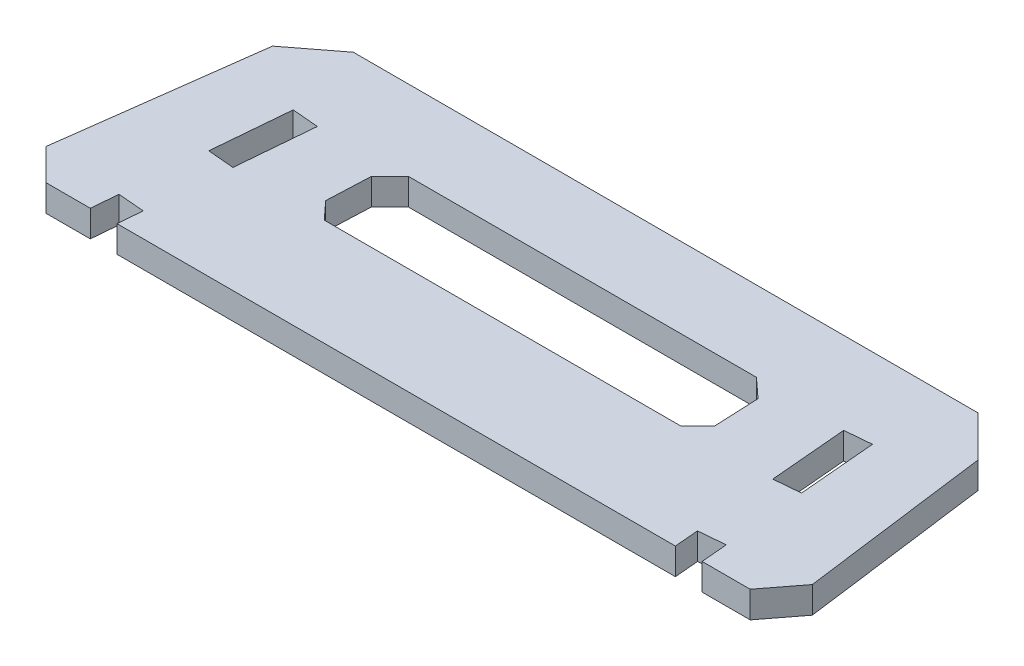
ISO-10303-21;
HEADER;
FILE_DESCRIPTION(('STEP AP214'),'2;1');
FILE_NAME('part.step','',(''),(''),'','','');
FILE_SCHEMA(('AUTOMOTIVE_DESIGN { 1 0 10303 214 1 1 1 1 }'));
ENDSEC;
DATA;
#1=APPLICATION_CONTEXT('core data for automotive mechanical design processes');
#2=APPLICATION_PROTOCOL_DEFINITION('international standard','automotive_design',2000,#1);
#3=PRODUCT_CONTEXT('',#1,'mechanical');
#4=PRODUCT('Part','Part','',(#3));
#5=PRODUCT_RELATED_PRODUCT_CATEGORY('part','',(#4));
#6=PRODUCT_DEFINITION_FORMATION('','',#4);
#7=PRODUCT_DEFINITION_CONTEXT('part definition',#1,'design');
#8=PRODUCT_DEFINITION('design','',#6,#7);
#9=PRODUCT_DEFINITION_SHAPE('','',#8);
#10=(LENGTH_UNIT() NAMED_UNIT(*) SI_UNIT(.MILLI.,.METRE.));
#11=(NAMED_UNIT(*) PLANE_ANGLE_UNIT() SI_UNIT($,.RADIAN.));
#12=(NAMED_UNIT(*) SI_UNIT($,.STERADIAN.) SOLID_ANGLE_UNIT());
#13=UNCERTAINTY_MEASURE_WITH_UNIT(LENGTH_MEASURE(1.E-05),#10,'distance_accuracy_value','');
#14=(GEOMETRIC_REPRESENTATION_CONTEXT(3) GLOBAL_UNCERTAINTY_ASSIGNED_CONTEXT((#13)) GLOBAL_UNIT_ASSIGNED_CONTEXT((#10,
#11,#12)) REPRESENTATION_CONTEXT('',''));
#15=CARTESIAN_POINT('',(0.,0.,0.));
#16=DIRECTION('',(0.,0.,1.));
#17=DIRECTION('',(1.,0.,0.));
#18=AXIS2_PLACEMENT_3D('',#15,#16,#17);
#19=CARTESIAN_POINT('',(-197.980321350722,-15.,2.22044604925031E-13));
#20=DIRECTION('',(0.,0.,-0.999999999999999));
#21=DIRECTION('',(-1.,0.,0.));
#22=AXIS2_PLACEMENT_3D('',#19,#20,#21);
#23=PLANE('',#22);
#24=DIRECTION('',(-1.,0.,0.));
#25=VECTOR('',#24,1.);
#26=CARTESIAN_POINT('',(-197.980321350722,-15.,2.22044604925031E-13));
#27=LINE('',#26,#25);
#28=CARTESIAN_POINT('',(177.980321350722,-15.,2.22044604925031E-13));
#29=VERTEX_POINT('',#28);
#30=CARTESIAN_POINT('',(-174.759320617822,-15.,2.22044604925031E-13));
#31=VERTEX_POINT('',#30);
#32=EDGE_CURVE('E343',#29,#31,#27,.T.);
#33=ORIENTED_EDGE('',*,*,#32,.T.);
#34=DIRECTION('',(0.,0.999999999999999,0.));
#35=VECTOR('',#34,1.);
#36=CARTESIAN_POINT('',(-174.759320617822,-15.,2.22044604925031E-13));
#37=LINE('',#36,#35);
#38=CARTESIAN_POINT('',(-174.759320617822,0.,0.));
#39=VERTEX_POINT('',#38);
#40=EDGE_CURVE('E11',#31,#39,#37,.T.);
#41=ORIENTED_EDGE('',*,*,#40,.T.);
#42=DIRECTION('',(-1.,0.,0.));
#43=VECTOR('',#42,1.);
#44=CARTESIAN_POINT('',(-197.980321350722,0.,0.));
#45=LINE('',#44,#43);
#46=CARTESIAN_POINT('',(177.980321350722,0.,0.));
#47=VERTEX_POINT('',#46);
#48=EDGE_CURVE('E332',#47,#39,#45,.T.);
#49=ORIENTED_EDGE('',*,*,#48,.F.);
#50=DIRECTION('',(0.,-0.999999999999999,0.));
#51=VECTOR('',#50,1.);
#52=CARTESIAN_POINT('',(177.980321350722,-15.,2.22044604925031E-13));
#53=LINE('',#52,#51);
#54=EDGE_CURVE('E40',#47,#29,#53,.T.);
#55=ORIENTED_EDGE('',*,*,#54,.T.);
#56=EDGE_LOOP('',(#33,#41,#49,#55));
#57=FACE_BOUND('',#56,.T.);
#58=ADVANCED_FACE('F32',(#57),#23,.T.);
#59=CARTESIAN_POINT('',(197.980321350722,-15.,2.22044604925031E-13));
#60=DIRECTION('',(0.991487933295307,0.,-0.130198610322082));
#61=DIRECTION('',(-0.130198610322082,0.,-0.991487933295306));
#62=AXIS2_PLACEMENT_3D('',#59,#60,#61);
#63=PLANE('',#62);
#64=DIRECTION('',(-0.130198610322082,0.,-0.991487933295306));
#65=VECTOR('',#64,1.);
#66=CARTESIAN_POINT('',(197.980321350722,0.,0.));
#67=LINE('',#66,#65);
#68=CARTESIAN_POINT('',(215.149047853911,0.,130.743216965596));
#69=VERTEX_POINT('',#68);
#70=CARTESIAN_POINT('',(201.003663376434,0.,23.0233420257117));
#71=VERTEX_POINT('',#70);
#72=EDGE_CURVE('E347',#69,#71,#67,.T.);
#73=ORIENTED_EDGE('',*,*,#72,.F.);
#74=DIRECTION('',(0.,-0.999999999999999,0.));
#75=VECTOR('',#74,1.);
#76=CARTESIAN_POINT('',(215.149047853911,-15.,130.743216965596));
#77=LINE('',#76,#75);
#78=CARTESIAN_POINT('',(215.149047853911,-15.,130.743216965596));
#79=VERTEX_POINT('',#78);
#80=EDGE_CURVE('E478',#69,#79,#77,.T.);
#81=ORIENTED_EDGE('',*,*,#80,.T.);
#82=DIRECTION('',(-0.130198610322082,0.,-0.991487933295306));
#83=VECTOR('',#82,1.);
#84=CARTESIAN_POINT('',(197.980321350722,-15.,2.22044604925031E-13));
#85=LINE('',#84,#83);
#86=CARTESIAN_POINT('',(201.003663376434,-15.,23.0233420257117));
#87=VERTEX_POINT('',#86);
#88=EDGE_CURVE('E375',#79,#87,#85,.T.);
#89=ORIENTED_EDGE('',*,*,#88,.T.);
#90=DIRECTION('',(0.,0.999999999999999,0.));
#91=VECTOR('',#90,1.);
#92=CARTESIAN_POINT('',(201.003663376434,-15.,23.0233420257117));
#93=LINE('',#92,#91);
#94=EDGE_CURVE('E475',#87,#71,#93,.T.);
#95=ORIENTED_EDGE('',*,*,#94,.T.);
#96=EDGE_LOOP('',(#73,#81,#89,#95));
#97=FACE_BOUND('',#96,.T.);
#98=ADVANCED_FACE('F504',(#97),#63,.T.);
#99=CARTESIAN_POINT('',(217.753020060352,-15.,150.572975631502));
#100=DIRECTION('',(0.,0.,0.999999999999999));
#101=DIRECTION('',(1.,0.,0.));
#102=AXIS2_PLACEMENT_3D('',#99,#100,#101);
#103=PLANE('',#102);
#104=DIRECTION('',(1.,0.,0.));
#105=VECTOR('',#104,1.);
#106=CARTESIAN_POINT('',(217.753020060352,-15.,150.572975631502));
#107=LINE('',#106,#105);
#108=CARTESIAN_POINT('',(172.735338859236,-15.,150.572975631502));
#109=VERTEX_POINT('',#108);
#110=CARTESIAN_POINT('',(199.92272681684,-15.,150.572975631502));
#111=VERTEX_POINT('',#110);
#112=EDGE_CURVE('E372',#109,#111,#107,.T.);
#113=ORIENTED_EDGE('',*,*,#112,.T.);
#114=DIRECTION('',(0.,0.999999999999999,0.));
#115=VECTOR('',#114,1.);
#116=CARTESIAN_POINT('',(199.92272681684,-15.,150.572975631502));
#117=LINE('',#116,#115);
#118=CARTESIAN_POINT('',(199.92272681684,0.,150.572975631502));
#119=VERTEX_POINT('',#118);
#120=EDGE_CURVE('E464',#111,#119,#117,.T.);
#121=ORIENTED_EDGE('',*,*,#120,.T.);
#122=DIRECTION('',(1.,0.,0.));
#123=VECTOR('',#122,1.);
#124=CARTESIAN_POINT('',(217.753020060352,0.,150.572975631502));
#125=LINE('',#124,#123);
#126=CARTESIAN_POINT('',(172.735338859236,0.,150.572975631502));
#127=VERTEX_POINT('',#126);
#128=EDGE_CURVE('E407',#127,#119,#125,.T.);
#129=ORIENTED_EDGE('',*,*,#128,.F.);
#130=DIRECTION('',(0.,0.999999999999999,0.));
#131=VECTOR('',#130,1.);
#132=CARTESIAN_POINT('',(172.735338859236,-15.,150.572975631502));
#133=LINE('',#132,#131);
#134=EDGE_CURVE('E412',#109,#127,#133,.T.);
#135=ORIENTED_EDGE('',*,*,#134,.F.);
#136=EDGE_LOOP('',(#113,#121,#129,#135));
#137=FACE_BOUND('',#136,.T.);
#138=ADVANCED_FACE('F514',(#137),#103,.T.);
#139=CARTESIAN_POINT('',(172.735338859236,-15.,150.572975631502));
#140=DIRECTION('',(-0.996223440096612,0.,0.0868265938642716));
#141=DIRECTION('',(0.0868265938642717,0.,0.996223440096611));
#142=AXIS2_PLACEMENT_3D('',#139,#140,#141);
#143=PLANE('',#142);
#144=DIRECTION('',(0.0868265938642717,0.,0.996223440096611));
#145=VECTOR('',#144,1.);
#146=CARTESIAN_POINT('',(172.735338859236,0.,150.572975631502));
#147=LINE('',#146,#145);
#148=CARTESIAN_POINT('',(171.432941588778,0.,135.629642818325));
#149=VERTEX_POINT('',#148);
#150=EDGE_CURVE('E404',#149,#127,#147,.T.);
#151=ORIENTED_EDGE('',*,*,#150,.F.);
#152=DIRECTION('',(0.,0.999999999999999,0.));
#153=VECTOR('',#152,1.);
#154=CARTESIAN_POINT('',(171.432941588778,-15.,135.629642818325));
#155=LINE('',#154,#153);
#156=CARTESIAN_POINT('',(171.432941588778,-15.,135.629642818325));
#157=VERTEX_POINT('',#156);
#158=EDGE_CURVE('E415',#157,#149,#155,.T.);
#159=ORIENTED_EDGE('',*,*,#158,.F.);
#160=DIRECTION('',(0.0868265938642717,0.,0.996223440096611));
#161=VECTOR('',#160,1.);
#162=CARTESIAN_POINT('',(172.735338859236,-15.,150.572975631502));
#163=LINE('',#162,#161);
#164=EDGE_CURVE('E369',#157,#109,#163,.T.);
#165=ORIENTED_EDGE('',*,*,#164,.T.);
#166=ORIENTED_EDGE('',*,*,#134,.T.);
#167=EDGE_LOOP('',(#151,#159,#165,#166));
#168=FACE_BOUND('',#167,.T.);
#169=ADVANCED_FACE('F520',(#168),#143,.T.);
#170=CARTESIAN_POINT('',(171.432941588778,-15.,135.629642818325));
#171=DIRECTION('',(0.0868265938642408,0.,0.996223440096614));
#172=DIRECTION('',(0.996223440096615,0.,-0.0868265938642407));
#173=AXIS2_PLACEMENT_3D('',#170,#171,#172);
#174=PLANE('',#173);
#175=DIRECTION('',(0.996223440096615,0.,-0.0868265938642407));
#176=VECTOR('',#175,1.);
#177=CARTESIAN_POINT('',(171.432941588778,0.,135.629642818325));
#178=LINE('',#177,#176);
#179=CARTESIAN_POINT('',(156.489589987329,0.,136.932041726289));
#180=VERTEX_POINT('',#179);
#181=EDGE_CURVE('E401',#180,#149,#178,.T.);
#182=ORIENTED_EDGE('',*,*,#181,.F.);
#183=DIRECTION('',(0.,0.999999999999999,0.));
#184=VECTOR('',#183,1.);
#185=CARTESIAN_POINT('',(156.489589987329,-15.,136.932041726289));
#186=LINE('',#185,#184);
#187=CARTESIAN_POINT('',(156.489589987329,-15.,136.932041726289));
#188=VERTEX_POINT('',#187);
#189=EDGE_CURVE('E417',#188,#180,#186,.T.);
#190=ORIENTED_EDGE('',*,*,#189,.F.);
#191=DIRECTION('',(0.996223440096615,0.,-0.0868265938642407));
#192=VECTOR('',#191,1.);
#193=CARTESIAN_POINT('',(171.432941588778,-15.,135.629642818325));
#194=LINE('',#193,#192);
#195=EDGE_CURVE('E366',#188,#157,#194,.T.);
#196=ORIENTED_EDGE('',*,*,#195,.T.);
#197=ORIENTED_EDGE('',*,*,#158,.T.);
#198=EDGE_LOOP('',(#182,#190,#196,#197));
#199=FACE_BOUND('',#198,.T.);
#200=ADVANCED_FACE('F523',(#199),#174,.T.);
#201=CARTESIAN_POINT('',(156.489589987329,-15.,136.932041726289));
#202=DIRECTION('',(0.996223440096615,0.,-0.0868265938642424));
#203=DIRECTION('',(-0.0868265938642425,0.,-0.996223440096614));
#204=AXIS2_PLACEMENT_3D('',#201,#202,#203);
#205=PLANE('',#204);
#206=DIRECTION('',(-0.0868265938642425,0.,-0.996223440096614));
#207=VECTOR('',#206,1.);
#208=CARTESIAN_POINT('',(156.489589987329,0.,136.932041726289));
#209=LINE('',#208,#207);
#210=CARTESIAN_POINT('',(157.678475713609,0.,150.572975631502));
#211=VERTEX_POINT('',#210);
#212=EDGE_CURVE('E398',#211,#180,#209,.T.);
#213=ORIENTED_EDGE('',*,*,#212,.F.);
#214=DIRECTION('',(0.,0.999999999999999,0.));
#215=VECTOR('',#214,1.);
#216=CARTESIAN_POINT('',(157.678475713609,-15.,150.572975631502));
#217=LINE('',#216,#215);
#218=CARTESIAN_POINT('',(157.678475713609,-15.,150.572975631502));
#219=VERTEX_POINT('',#218);
#220=EDGE_CURVE('E419',#219,#211,#217,.T.);
#221=ORIENTED_EDGE('',*,*,#220,.F.);
#222=DIRECTION('',(-0.0868265938642425,0.,-0.996223440096614));
#223=VECTOR('',#222,1.);
#224=CARTESIAN_POINT('',(156.489589987329,-15.,136.932041726289));
#225=LINE('',#224,#223);
#226=EDGE_CURVE('E363',#219,#188,#225,.T.);
#227=ORIENTED_EDGE('',*,*,#226,.T.);
#228=ORIENTED_EDGE('',*,*,#189,.T.);
#229=EDGE_LOOP('',(#213,#221,#227,#228));
#230=FACE_BOUND('',#229,.T.);
#231=ADVANCED_FACE('F528',(#230),#205,.T.);
#232=CARTESIAN_POINT('',(157.678475713609,-15.,150.572975631502));
#233=DIRECTION('',(0.,0.,0.999999999999999));
#234=DIRECTION('',(1.,0.,0.));
#235=AXIS2_PLACEMENT_3D('',#232,#233,#234);
#236=PLANE('',#235);
#237=DIRECTION('',(1.,0.,0.));
#238=VECTOR('',#237,1.);
#239=CARTESIAN_POINT('',(157.678475713609,0.,150.572975631502));
#240=LINE('',#239,#238);
#241=CARTESIAN_POINT('',(-157.67847571361,0.,150.572975631502));
#242=VERTEX_POINT('',#241);
#243=EDGE_CURVE('E395',#242,#211,#240,.T.);
#244=ORIENTED_EDGE('',*,*,#243,.F.);
#245=DIRECTION('',(0.,0.999999999999999,0.));
#246=VECTOR('',#245,1.);
#247=CARTESIAN_POINT('',(-157.67847571361,-15.,150.572975631502));
#248=LINE('',#247,#246);
#249=CARTESIAN_POINT('',(-157.67847571361,-15.,150.572975631502));
#250=VERTEX_POINT('',#249);
#251=EDGE_CURVE('E421',#250,#242,#248,.T.);
#252=ORIENTED_EDGE('',*,*,#251,.F.);
#253=DIRECTION('',(1.,0.,0.));
#254=VECTOR('',#253,1.);
#255=CARTESIAN_POINT('',(157.678475713609,-15.,150.572975631502));
#256=LINE('',#255,#254);
#257=EDGE_CURVE('E360',#250,#219,#256,.T.);
#258=ORIENTED_EDGE('',*,*,#257,.T.);
#259=ORIENTED_EDGE('',*,*,#220,.T.);
#260=EDGE_LOOP('',(#244,#252,#258,#259));
#261=FACE_BOUND('',#260,.T.);
#262=ADVANCED_FACE('F531',(#261),#236,.T.);
#263=CARTESIAN_POINT('',(-156.489589987329,-15.,136.932041726289));
#264=DIRECTION('',(-0.996223440096611,0.,-0.0868265938642858));
#265=DIRECTION('',(-0.0868265938642859,0.,0.99622344009661));
#266=AXIS2_PLACEMENT_3D('',#263,#264,#265);
#267=PLANE('',#266);
#268=DIRECTION('',(-0.0868265938642859,0.,0.99622344009661));
#269=VECTOR('',#268,1.);
#270=CARTESIAN_POINT('',(-156.489589987329,0.,136.932041726289));
#271=LINE('',#270,#269);
#272=CARTESIAN_POINT('',(-156.489589987329,0.,136.932041726289));
#273=VERTEX_POINT('',#272);
#274=EDGE_CURVE('E392',#273,#242,#271,.T.);
#275=ORIENTED_EDGE('',*,*,#274,.F.);
#276=DIRECTION('',(0.,0.999999999999999,0.));
#277=VECTOR('',#276,1.);
#278=CARTESIAN_POINT('',(-156.489589987329,-15.,136.932041726289));
#279=LINE('',#278,#277);
#280=CARTESIAN_POINT('',(-156.489589987329,-15.,136.932041726289));
#281=VERTEX_POINT('',#280);
#282=EDGE_CURVE('E423',#281,#273,#279,.T.);
#283=ORIENTED_EDGE('',*,*,#282,.F.);
#284=DIRECTION('',(-0.0868265938642859,0.,0.99622344009661));
#285=VECTOR('',#284,1.);
#286=CARTESIAN_POINT('',(-156.489589987329,-15.,136.932041726289));
#287=LINE('',#286,#285);
#288=EDGE_CURVE('E357',#281,#250,#287,.T.);
#289=ORIENTED_EDGE('',*,*,#288,.T.);
#290=ORIENTED_EDGE('',*,*,#251,.T.);
#291=EDGE_LOOP('',(#275,#283,#289,#290));
#292=FACE_BOUND('',#291,.T.);
#293=ADVANCED_FACE('F536',(#292),#267,.T.);
#294=CARTESIAN_POINT('',(-171.432941588778,-15.,135.629642818325));
#295=DIRECTION('',(-0.0868265938642331,0.,0.996223440096614));
#296=DIRECTION('',(0.996223440096616,0.,0.086826593864233));
#297=AXIS2_PLACEMENT_3D('',#294,#295,#296);
#298=PLANE('',#297);
#299=DIRECTION('',(0.996223440096616,0.,0.086826593864233));
#300=VECTOR('',#299,1.);
#301=CARTESIAN_POINT('',(-171.432941588778,0.,135.629642818325));
#302=LINE('',#301,#300);
#303=CARTESIAN_POINT('',(-171.432941588778,0.,135.629642818325));
#304=VERTEX_POINT('',#303);
#305=EDGE_CURVE('E389',#304,#273,#302,.T.);
#306=ORIENTED_EDGE('',*,*,#305,.F.);
#307=DIRECTION('',(0.,0.999999999999999,0.));
#308=VECTOR('',#307,1.);
#309=CARTESIAN_POINT('',(-171.432941588778,-15.,135.629642818325));
#310=LINE('',#309,#308);
#311=CARTESIAN_POINT('',(-171.432941588778,-15.,135.629642818325));
#312=VERTEX_POINT('',#311);
#313=EDGE_CURVE('E425',#312,#304,#310,.T.);
#314=ORIENTED_EDGE('',*,*,#313,.F.);
#315=DIRECTION('',(0.996223440096616,0.,0.086826593864233));
#316=VECTOR('',#315,1.);
#317=CARTESIAN_POINT('',(-171.432941588778,-15.,135.629642818325));
#318=LINE('',#317,#316);
#319=EDGE_CURVE('E354',#312,#281,#318,.T.);
#320=ORIENTED_EDGE('',*,*,#319,.T.);
#321=ORIENTED_EDGE('',*,*,#282,.T.);
#322=EDGE_LOOP('',(#306,#314,#320,#321));
#323=FACE_BOUND('',#322,.T.);
#324=ADVANCED_FACE('F539',(#323),#298,.T.);
#325=CARTESIAN_POINT('',(-172.735338859236,-15.,150.572975631502));
#326=DIRECTION('',(0.996223440096615,0.,0.0868265938642385));
#327=DIRECTION('',(0.0868265938642386,0.,-0.996223440096614));
#328=AXIS2_PLACEMENT_3D('',#325,#326,#327);
#329=PLANE('',#328);
#330=DIRECTION('',(0.0868265938642386,0.,-0.996223440096614));
#331=VECTOR('',#330,1.);
#332=CARTESIAN_POINT('',(-172.735338859236,0.,150.572975631502));
#333=LINE('',#332,#331);
#334=CARTESIAN_POINT('',(-172.735338859236,0.,150.572975631502));
#335=VERTEX_POINT('',#334);
#336=EDGE_CURVE('E386',#335,#304,#333,.T.);
#337=ORIENTED_EDGE('',*,*,#336,.F.);
#338=DIRECTION('',(0.,0.999999999999999,0.));
#339=VECTOR('',#338,1.);
#340=CARTESIAN_POINT('',(-172.735338859236,-15.,150.572975631502));
#341=LINE('',#340,#339);
#342=CARTESIAN_POINT('',(-172.735338859236,-15.,150.572975631502));
#343=VERTEX_POINT('',#342);
#344=EDGE_CURVE('E378',#343,#335,#341,.T.);
#345=ORIENTED_EDGE('',*,*,#344,.F.);
#346=DIRECTION('',(0.0868265938642386,0.,-0.996223440096614));
#347=VECTOR('',#346,1.);
#348=CARTESIAN_POINT('',(-172.735338859236,-15.,150.572975631502));
#349=LINE('',#348,#347);
#350=EDGE_CURVE('E351',#343,#312,#349,.T.);
#351=ORIENTED_EDGE('',*,*,#350,.T.);
#352=ORIENTED_EDGE('',*,*,#313,.T.);
#353=EDGE_LOOP('',(#337,#345,#351,#352));
#354=FACE_BOUND('',#353,.T.);
#355=ADVANCED_FACE('F544',(#354),#329,.T.);
#356=CARTESIAN_POINT('',(-217.753020060352,-15.,150.572975631502));
#357=DIRECTION('',(0.,0.,0.999999999999999));
#358=DIRECTION('',(1.,0.,0.));
#359=AXIS2_PLACEMENT_3D('',#356,#357,#358);
#360=PLANE('',#359);
#361=DIRECTION('',(1.,0.,0.));
#362=VECTOR('',#361,1.);
#363=CARTESIAN_POINT('',(-217.753020060352,0.,150.572975631502));
#364=LINE('',#363,#362);
#365=CARTESIAN_POINT('',(-197.753020060352,0.,150.572975631502));
#366=VERTEX_POINT('',#365);
#367=EDGE_CURVE('E384',#366,#335,#364,.T.);
#368=ORIENTED_EDGE('',*,*,#367,.F.);
#369=DIRECTION('',(0.,-0.999999999999999,0.));
#370=VECTOR('',#369,1.);
#371=CARTESIAN_POINT('',(-197.753020060352,-15.,150.572975631502));
#372=LINE('',#371,#370);
#373=CARTESIAN_POINT('',(-197.753020060352,-15.,150.572975631502));
#374=VERTEX_POINT('',#373);
#375=EDGE_CURVE('E491',#366,#374,#372,.T.);
#376=ORIENTED_EDGE('',*,*,#375,.T.);
#377=DIRECTION('',(1.,0.,0.));
#378=VECTOR('',#377,1.);
#379=CARTESIAN_POINT('',(-217.753020060352,-15.,150.572975631502));
#380=LINE('',#379,#378);
#381=EDGE_CURVE('E349',#374,#343,#380,.T.);
#382=ORIENTED_EDGE('',*,*,#381,.T.);
#383=ORIENTED_EDGE('',*,*,#344,.T.);
#384=EDGE_LOOP('',(#368,#376,#382,#383));
#385=FACE_BOUND('',#384,.T.);
#386=ADVANCED_FACE('F547',(#385),#360,.T.);
#387=CARTESIAN_POINT('',(-217.753020060352,-15.,150.572975631502));
#388=DIRECTION('',(-0.991487933295307,0.,-0.130198610322082));
#389=DIRECTION('',(-0.130198610322082,0.,0.991487933295306));
#390=AXIS2_PLACEMENT_3D('',#387,#388,#389);
#391=PLANE('',#390);
#392=DIRECTION('',(-0.130198610322082,0.,0.991487933295306));
#393=VECTOR('',#392,1.);
#394=CARTESIAN_POINT('',(-217.753020060352,-15.,150.572975631502));
#395=LINE('',#394,#393);
#396=CARTESIAN_POINT('',(-200.584293557164,-15.,19.8297586659063));
#397=VERTEX_POINT('',#396);
#398=CARTESIAN_POINT('',(-215.431540658412,-15.,132.894455033442));
#399=VERTEX_POINT('',#398);
#400=EDGE_CURVE('E346',#397,#399,#395,.T.);
#401=ORIENTED_EDGE('',*,*,#400,.T.);
#402=DIRECTION('',(0.,0.999999999999999,0.));
#403=VECTOR('',#402,1.);
#404=CARTESIAN_POINT('',(-215.431540658412,-15.,132.894455033442));
#405=LINE('',#404,#403);
#406=CARTESIAN_POINT('',(-215.431540658412,0.,132.894455033442));
#407=VERTEX_POINT('',#406);
#408=EDGE_CURVE('E488',#399,#407,#405,.T.);
#409=ORIENTED_EDGE('',*,*,#408,.T.);
#410=DIRECTION('',(-0.130198610322082,0.,0.991487933295306));
#411=VECTOR('',#410,1.);
#412=CARTESIAN_POINT('',(-217.753020060352,0.,150.572975631502));
#413=LINE('',#412,#411);
#414=CARTESIAN_POINT('',(-200.584293557164,0.,19.8297586659063));
#415=VERTEX_POINT('',#414);
#416=EDGE_CURVE('E381',#415,#407,#413,.T.);
#417=ORIENTED_EDGE('',*,*,#416,.F.);
#418=DIRECTION('',(0.,-0.999999999999999,0.));
#419=VECTOR('',#418,1.);
#420=CARTESIAN_POINT('',(-200.584293557164,-15.,19.8297586659061));
#421=LINE('',#420,#419);
#422=EDGE_CURVE('E54',#415,#397,#421,.T.);
#423=ORIENTED_EDGE('',*,*,#422,.T.);
#424=EDGE_LOOP('',(#401,#409,#417,#423));
#425=FACE_BOUND('',#424,.T.);
#426=ADVANCED_FACE('F552',(#425),#391,.T.);
#427=CARTESIAN_POINT('',(0.,-15.,2.22044604925031E-13));
#428=DIRECTION('',(0.,0.999999999999999,0.));
#429=DIRECTION('',(0.,0.,0.999999999999999));
#430=AXIS2_PLACEMENT_3D('',#427,#428,#429);
#431=PLANE('',#430);
#432=DIRECTION('',(0.0868265938642406,0.,0.996223440096614));
#433=VECTOR('',#432,1.);
#434=CARTESIAN_POINT('',(152.429155902054,-15.,90.343785378901));
#435=LINE('',#434,#433);
#436=CARTESIAN_POINT('',(148.605677587565,-15.,46.4742915974143));
#437=VERTEX_POINT('',#436);
#438=CARTESIAN_POINT('',(152.429155902054,-15.,90.343785378901));
#439=VERTEX_POINT('',#438);
#440=EDGE_CURVE('E255',#437,#439,#435,.T.);
#441=ORIENTED_EDGE('',*,*,#440,.T.);
#442=DIRECTION('',(0.996223440096615,0.,-0.0868265938642403));
#443=VECTOR('',#442,1.);
#444=CARTESIAN_POINT('',(167.372507503504,-15.,89.0413864709374));
#445=LINE('',#444,#443);
#446=CARTESIAN_POINT('',(167.372507503504,-15.,89.0413864709374));
#447=VERTEX_POINT('',#446);
#448=EDGE_CURVE('E247',#439,#447,#445,.T.);
#449=ORIENTED_EDGE('',*,*,#448,.T.);
#450=DIRECTION('',(-0.0868265938642406,0.,-0.996223440096614));
#451=VECTOR('',#450,1.);
#452=CARTESIAN_POINT('',(163.549029189015,-15.,45.1718926894505));
#453=LINE('',#452,#451);
#454=CARTESIAN_POINT('',(163.549029189015,-15.,45.1718926894505));
#455=VERTEX_POINT('',#454);
#456=EDGE_CURVE('E259',#447,#455,#453,.T.);
#457=ORIENTED_EDGE('',*,*,#456,.T.);
#458=DIRECTION('',(-0.996223440096615,0.,0.0868265938642403));
#459=VECTOR('',#458,1.);
#460=CARTESIAN_POINT('',(148.605677587565,-15.,46.4742915974143));
#461=LINE('',#460,#459);
#462=EDGE_CURVE('E263',#455,#437,#461,.T.);
#463=ORIENTED_EDGE('',*,*,#462,.T.);
#464=EDGE_LOOP('',(#441,#449,#457,#463));
#465=FACE_BOUND('',#464,.T.);
#466=DIRECTION('',(0.0868265938642406,0.,-0.996223440096614));
#467=VECTOR('',#466,1.);
#468=CARTESIAN_POINT('',(-152.429155902054,-15.,90.3437853789011));
#469=LINE('',#468,#467);
#470=CARTESIAN_POINT('',(-152.429155902054,-15.,90.3437853789011));
#471=VERTEX_POINT('',#470);
#472=CARTESIAN_POINT('',(-148.605677587565,-15.,46.4742915974141));
#473=VERTEX_POINT('',#472);
#474=EDGE_CURVE('E297',#471,#473,#469,.T.);
#475=ORIENTED_EDGE('',*,*,#474,.T.);
#476=DIRECTION('',(-0.996223440096615,0.,-0.0868265938642403));
#477=VECTOR('',#476,1.);
#478=CARTESIAN_POINT('',(-148.605677587565,-15.,46.4742915974141));
#479=LINE('',#478,#477);
#480=CARTESIAN_POINT('',(-163.549029189015,-15.,45.1718926894505));
#481=VERTEX_POINT('',#480);
#482=EDGE_CURVE('E287',#473,#481,#479,.T.);
#483=ORIENTED_EDGE('',*,*,#482,.T.);
#484=DIRECTION('',(-0.0868265938642406,0.,0.996223440096614));
#485=VECTOR('',#484,1.);
#486=CARTESIAN_POINT('',(-163.549029189015,-15.,45.1718926894505));
#487=LINE('',#486,#485);
#488=CARTESIAN_POINT('',(-167.372507503504,-15.,89.0413864709375));
#489=VERTEX_POINT('',#488);
#490=EDGE_CURVE('E290',#481,#489,#487,.T.);
#491=ORIENTED_EDGE('',*,*,#490,.T.);
#492=DIRECTION('',(0.996223440096615,0.,0.0868265938642403));
#493=VECTOR('',#492,1.);
#494=CARTESIAN_POINT('',(-167.372507503504,-15.,89.0413864709375));
#495=LINE('',#494,#493);
#496=EDGE_CURVE('E294',#489,#471,#495,.T.);
#497=ORIENTED_EDGE('',*,*,#496,.T.);
#498=EDGE_LOOP('',(#475,#483,#491,#497));
#499=FACE_BOUND('',#498,.T.);
#500=DIRECTION('',(1.,0.,0.));
#501=VECTOR('',#500,1.);
#502=CARTESIAN_POINT('',(110.449460378403,-15.,90.3437853789011));
#503=LINE('',#502,#501);
#504=CARTESIAN_POINT('',(-100.855771125688,-15.,90.3437853789011));
#505=VERTEX_POINT('',#504);
#506=CARTESIAN_POINT('',(100.449460378403,-15.,90.3437853789011));
#507=VERTEX_POINT('',#506);
#508=EDGE_CURVE('E326',#505,#507,#503,.T.);
#509=ORIENTED_EDGE('',*,*,#508,.T.);
#510=DIRECTION('',(-0.707106781186543,0.,0.707106781186551));
#511=VECTOR('',#510,1.);
#512=CARTESIAN_POINT('',(95.3966228786525,-15.,95.3966228786515));
#513=LINE('',#512,#511);
#514=CARTESIAN_POINT('',(110.034156304942,-15.,80.7590894523616));
#515=VERTEX_POINT('',#514);
#516=EDGE_CURVE('E458',#507,#515,#513,.F.);
#517=ORIENTED_EDGE('',*,*,#516,.T.);
#518=DIRECTION('',(-0.0432892980500775,0.,-0.99906257895806));
#519=VECTOR('',#518,1.);
#520=CARTESIAN_POINT('',(108.492166043388,-15.,45.1718926894505));
#521=LINE('',#520,#519);
#522=CARTESIAN_POINT('',(108.925059023889,-15.,55.1625184790314));
#523=VERTEX_POINT('',#522);
#524=EDGE_CURVE('E329',#515,#523,#521,.T.);
#525=ORIENTED_EDGE('',*,*,#524,.T.);
#526=DIRECTION('',(0.737054080614984,0.,0.675833768206946));
#527=VECTOR('',#526,1.);
#528=CARTESIAN_POINT('',(22.2737736752532,-15.,-24.2914405144268));
#529=LINE('',#528,#527);
#530=CARTESIAN_POINT('',(98.029433719986,-15.,45.1718926894505));
#531=VERTEX_POINT('',#530);
#532=EDGE_CURVE('E454',#523,#531,#529,.F.);
#533=ORIENTED_EDGE('',*,*,#532,.T.);
#534=DIRECTION('',(-1.,0.,0.));
#535=VECTOR('',#534,1.);
#536=CARTESIAN_POINT('',(-108.492166043388,-15.,45.1718926894505));
#537=LINE('',#536,#535);
#538=CARTESIAN_POINT('',(-98.4921660433883,-15.,45.1718926894505));
#539=VERTEX_POINT('',#538);
#540=EDGE_CURVE('E319',#531,#539,#537,.T.);
#541=ORIENTED_EDGE('',*,*,#540,.T.);
#542=DIRECTION('',(0.707106781186544,0.,-0.70710678118655));
#543=VECTOR('',#542,1.);
#544=CARTESIAN_POINT('',(-26.6601366769694,-15.,-26.6601366769691));
#545=LINE('',#544,#543);
#546=CARTESIAN_POINT('',(-108.945090381354,-15.,55.6248170274164));
#547=VERTEX_POINT('',#546);
#548=EDGE_CURVE('E450',#539,#547,#545,.F.);
#549=ORIENTED_EDGE('',*,*,#548,.T.);
#550=DIRECTION('',(-0.0432892980500775,0.,0.99906257895806));
#551=VECTOR('',#550,1.);
#552=CARTESIAN_POINT('',(-110.449460378403,-15.,90.3437853789011));
#553=LINE('',#552,#551);
#554=CARTESIAN_POINT('',(-110.016567397902,-15.,80.3531595893205));
#555=VERTEX_POINT('',#554);
#556=EDGE_CURVE('E322',#547,#555,#553,.T.);
#557=ORIENTED_EDGE('',*,*,#556,.T.);
#558=DIRECTION('',(-0.675833768206952,0.,-0.737054080614978));
#559=VECTOR('',#558,1.);
#560=CARTESIAN_POINT('',(-99.7923600907862,-15.,91.5035253615966));
#561=LINE('',#560,#559);
#562=EDGE_CURVE('E462',#555,#505,#561,.F.);
#563=ORIENTED_EDGE('',*,*,#562,.T.);
#564=EDGE_LOOP('',(#509,#517,#525,#533,#541,#549,#557,#563));
#565=FACE_BOUND('',#564,.T.);
#566=ORIENTED_EDGE('',*,*,#88,.F.);
#567=DIRECTION('',(0.609023520837936,0.,-0.793152161357556));
#568=VECTOR('',#567,1.);
#569=CARTESIAN_POINT('',(199.92272681684,-15.,150.572975631502));
#570=LINE('',#569,#568);
#571=EDGE_CURVE('E485',#79,#111,#570,.F.);
#572=ORIENTED_EDGE('',*,*,#571,.T.);
#573=ORIENTED_EDGE('',*,*,#112,.F.);
#574=ORIENTED_EDGE('',*,*,#164,.F.);
#575=ORIENTED_EDGE('',*,*,#195,.F.);
#576=ORIENTED_EDGE('',*,*,#226,.F.);
#577=ORIENTED_EDGE('',*,*,#257,.F.);
#578=ORIENTED_EDGE('',*,*,#288,.F.);
#579=ORIENTED_EDGE('',*,*,#319,.F.);
#580=ORIENTED_EDGE('',*,*,#350,.F.);
#581=ORIENTED_EDGE('',*,*,#381,.F.);
#582=DIRECTION('',(0.707106781186548,0.,0.707106781186546));
#583=VECTOR('',#582,1.);
#584=CARTESIAN_POINT('',(-215.431540658412,-15.,132.894455033442));
#585=LINE('',#584,#583);
#586=EDGE_CURVE('E47',#374,#399,#585,.F.);
#587=ORIENTED_EDGE('',*,*,#586,.T.);
#588=ORIENTED_EDGE('',*,*,#400,.F.);
#589=DIRECTION('',(-0.793152161357555,0.,0.609023520837938));
#590=VECTOR('',#589,1.);
#591=CARTESIAN_POINT('',(-174.759320617822,-15.,2.22044604925031E-13));
#592=LINE('',#591,#590);
#593=EDGE_CURVE('E482',#397,#31,#592,.F.);
#594=ORIENTED_EDGE('',*,*,#593,.T.);
#595=ORIENTED_EDGE('',*,*,#32,.F.);
#596=DIRECTION('',(-0.707106781186549,0.,-0.707106781186545));
#597=VECTOR('',#596,1.);
#598=CARTESIAN_POINT('',(201.003663376434,-15.,23.0233420257117));
#599=LINE('',#598,#597);
#600=EDGE_CURVE('E480',#29,#87,#599,.F.);
#601=ORIENTED_EDGE('',*,*,#600,.T.);
#602=EDGE_LOOP('',(#566,#572,#573,#574,#575,#576,#577,#578,#579,#580,#581,#587,#588,#594,#595,#601));
#603=FACE_BOUND('',#602,.T.);
#604=ADVANCED_FACE('F265',(#465,#499,#565,#603),#431,.F.);
#605=CARTESIAN_POINT('',(0.,0.,0.));
#606=DIRECTION('',(0.,0.999999999999999,0.));
#607=DIRECTION('',(0.,0.,0.999999999999999));
#608=AXIS2_PLACEMENT_3D('',#605,#606,#607);
#609=PLANE('',#608);
#610=DIRECTION('',(0.996223440096615,0.,-0.0868265938642403));
#611=VECTOR('',#610,1.);
#612=CARTESIAN_POINT('',(167.372507503504,0.,89.0413864709372));
#613=LINE('',#612,#611);
#614=CARTESIAN_POINT('',(152.429155902054,0.,90.3437853789008));
#615=VERTEX_POINT('',#614);
#616=CARTESIAN_POINT('',(167.372507503504,0.,89.0413864709372));
#617=VERTEX_POINT('',#616);
#618=EDGE_CURVE('E250',#615,#617,#613,.T.);
#619=ORIENTED_EDGE('',*,*,#618,.F.);
#620=DIRECTION('',(0.0868265938642406,0.,0.996223440096614));
#621=VECTOR('',#620,1.);
#622=CARTESIAN_POINT('',(152.429155902054,0.,90.3437853789008));
#623=LINE('',#622,#621);
#624=CARTESIAN_POINT('',(148.605677587565,0.,46.4742915974141));
#625=VERTEX_POINT('',#624);
#626=EDGE_CURVE('E268',#625,#615,#623,.T.);
#627=ORIENTED_EDGE('',*,*,#626,.F.);
#628=DIRECTION('',(-0.996223440096615,0.,0.0868265938642403));
#629=VECTOR('',#628,1.);
#630=CARTESIAN_POINT('',(148.605677587565,0.,46.4742915974141));
#631=LINE('',#630,#629);
#632=CARTESIAN_POINT('',(163.549029189015,0.,45.1718926894505));
#633=VERTEX_POINT('',#632);
#634=EDGE_CURVE('E271',#633,#625,#631,.T.);
#635=ORIENTED_EDGE('',*,*,#634,.F.);
#636=DIRECTION('',(-0.0868265938642406,0.,-0.996223440096614));
#637=VECTOR('',#636,1.);
#638=CARTESIAN_POINT('',(163.549029189015,0.,45.1718926894505));
#639=LINE('',#638,#637);
#640=EDGE_CURVE('E277',#617,#633,#639,.T.);
#641=ORIENTED_EDGE('',*,*,#640,.F.);
#642=EDGE_LOOP('',(#619,#627,#635,#641));
#643=FACE_BOUND('',#642,.T.);
#644=DIRECTION('',(-0.996223440096615,0.,-0.0868265938642403));
#645=VECTOR('',#644,1.);
#646=CARTESIAN_POINT('',(-148.605677587565,0.,46.4742915974141));
#647=LINE('',#646,#645);
#648=CARTESIAN_POINT('',(-148.605677587565,0.,46.4742915974141));
#649=VERTEX_POINT('',#648);
#650=CARTESIAN_POINT('',(-163.549029189015,0.,45.1718926894505));
#651=VERTEX_POINT('',#650);
#652=EDGE_CURVE('E283',#649,#651,#647,.T.);
#653=ORIENTED_EDGE('',*,*,#652,.F.);
#654=DIRECTION('',(0.0868265938642406,0.,-0.996223440096614));
#655=VECTOR('',#654,1.);
#656=CARTESIAN_POINT('',(-152.429155902054,0.,90.3437853789009));
#657=LINE('',#656,#655);
#658=CARTESIAN_POINT('',(-152.429155902054,0.,90.3437853789009));
#659=VERTEX_POINT('',#658);
#660=EDGE_CURVE('E291',#659,#649,#657,.T.);
#661=ORIENTED_EDGE('',*,*,#660,.F.);
#662=DIRECTION('',(0.996223440096615,0.,0.0868265938642403));
#663=VECTOR('',#662,1.);
#664=CARTESIAN_POINT('',(-167.372507503504,0.,89.0413864709373));
#665=LINE('',#664,#663);
#666=CARTESIAN_POINT('',(-167.372507503504,0.,89.0413864709373));
#667=VERTEX_POINT('',#666);
#668=EDGE_CURVE('E305',#667,#659,#665,.T.);
#669=ORIENTED_EDGE('',*,*,#668,.F.);
#670=DIRECTION('',(-0.0868265938642406,0.,0.996223440096614));
#671=VECTOR('',#670,1.);
#672=CARTESIAN_POINT('',(-163.549029189015,0.,45.1718926894505));
#673=LINE('',#672,#671);
#674=EDGE_CURVE('E302',#651,#667,#673,.T.);
#675=ORIENTED_EDGE('',*,*,#674,.F.);
#676=EDGE_LOOP('',(#653,#661,#669,#675));
#677=FACE_BOUND('',#676,.T.);
#678=DIRECTION('',(-1.,0.,0.));
#679=VECTOR('',#678,1.);
#680=CARTESIAN_POINT('',(-108.492166043388,0.,45.1718926894505));
#681=LINE('',#680,#679);
#682=CARTESIAN_POINT('',(98.029433719986,0.,45.1718926894505));
#683=VERTEX_POINT('',#682);
#684=CARTESIAN_POINT('',(-98.4921660433883,0.,45.1718926894505));
#685=VERTEX_POINT('',#684);
#686=EDGE_CURVE('E312',#683,#685,#681,.T.);
#687=ORIENTED_EDGE('',*,*,#686,.F.);
#688=DIRECTION('',(-0.737054080614984,0.,-0.675833768206946));
#689=VECTOR('',#688,1.);
#690=CARTESIAN_POINT('',(98.029433719986,0.,45.1718926894505));
#691=LINE('',#690,#689);
#692=CARTESIAN_POINT('',(108.925059023889,0.,55.1625184790311));
#693=VERTEX_POINT('',#692);
#694=EDGE_CURVE('E452',#683,#693,#691,.F.);
#695=ORIENTED_EDGE('',*,*,#694,.T.);
#696=DIRECTION('',(-0.0432892980500775,0.,-0.99906257895806));
#697=VECTOR('',#696,1.);
#698=CARTESIAN_POINT('',(108.492166043388,0.,45.1718926894505));
#699=LINE('',#698,#697);
#700=CARTESIAN_POINT('',(110.034156304942,0.,80.7590894523616));
#701=VERTEX_POINT('',#700);
#702=EDGE_CURVE('E323',#701,#693,#699,.T.);
#703=ORIENTED_EDGE('',*,*,#702,.F.);
#704=DIRECTION('',(0.707106781186543,0.,-0.707106781186551));
#705=VECTOR('',#704,1.);
#706=CARTESIAN_POINT('',(110.034156304942,0.,80.7590894523616));
#707=LINE('',#706,#705);
#708=CARTESIAN_POINT('',(100.449460378403,0.,90.3437853789009));
#709=VERTEX_POINT('',#708);
#710=EDGE_CURVE('E456',#701,#709,#707,.F.);
#711=ORIENTED_EDGE('',*,*,#710,.T.);
#712=DIRECTION('',(1.,0.,0.));
#713=VECTOR('',#712,1.);
#714=CARTESIAN_POINT('',(110.449460378403,0.,90.3437853789009));
#715=LINE('',#714,#713);
#716=CARTESIAN_POINT('',(-100.855771125688,0.,90.3437853789009));
#717=VERTEX_POINT('',#716);
#718=EDGE_CURVE('E338',#717,#709,#715,.T.);
#719=ORIENTED_EDGE('',*,*,#718,.F.);
#720=DIRECTION('',(0.675833768206952,0.,0.737054080614978));
#721=VECTOR('',#720,1.);
#722=CARTESIAN_POINT('',(-100.855771125688,0.,90.3437853789009));
#723=LINE('',#722,#721);
#724=CARTESIAN_POINT('',(-110.016567397902,0.,80.3531595893205));
#725=VERTEX_POINT('',#724);
#726=EDGE_CURVE('E460',#717,#725,#723,.F.);
#727=ORIENTED_EDGE('',*,*,#726,.T.);
#728=DIRECTION('',(-0.0432892980500775,0.,0.99906257895806));
#729=VECTOR('',#728,1.);
#730=CARTESIAN_POINT('',(-110.449460378403,0.,90.3437853789009));
#731=LINE('',#730,#729);
#732=CARTESIAN_POINT('',(-108.945090381354,0.,55.6248170274164));
#733=VERTEX_POINT('',#732);
#734=EDGE_CURVE('E335',#733,#725,#731,.T.);
#735=ORIENTED_EDGE('',*,*,#734,.F.);
#736=DIRECTION('',(-0.707106781186544,0.,0.70710678118655));
#737=VECTOR('',#736,1.);
#738=CARTESIAN_POINT('',(-108.945090381354,0.,55.6248170274164));
#739=LINE('',#738,#737);
#740=EDGE_CURVE('E448',#733,#685,#739,.F.);
#741=ORIENTED_EDGE('',*,*,#740,.T.);
#742=EDGE_LOOP('',(#687,#695,#703,#711,#719,#727,#735,#741));
#743=FACE_BOUND('',#742,.T.);
#744=ORIENTED_EDGE('',*,*,#128,.T.);
#745=DIRECTION('',(-0.609023520837936,0.,0.793152161357556));
#746=VECTOR('',#745,1.);
#747=CARTESIAN_POINT('',(198.50348159711,0.,152.421307222992));
#748=LINE('',#747,#746);
#749=EDGE_CURVE('E473',#119,#69,#748,.F.);
#750=ORIENTED_EDGE('',*,*,#749,.T.);
#751=ORIENTED_EDGE('',*,*,#72,.T.);
#752=DIRECTION('',(0.707106781186549,0.,0.707106781186545));
#753=VECTOR('',#752,1.);
#754=CARTESIAN_POINT('',(88.9901606753604,0.,-88.9901606753606));
#755=LINE('',#754,#753);
#756=EDGE_CURVE('E467',#71,#47,#755,.F.);
#757=ORIENTED_EDGE('',*,*,#756,.T.);
#758=ORIENTED_EDGE('',*,*,#48,.T.);
#759=DIRECTION('',(0.793152161357555,0.,-0.609023520837938));
#760=VECTOR('',#759,1.);
#761=CARTESIAN_POINT('',(-64.8199182582728,0.,-84.4171965556149));
#762=LINE('',#761,#760);
#763=EDGE_CURVE('E469',#39,#415,#762,.F.);
#764=ORIENTED_EDGE('',*,*,#763,.T.);
#765=ORIENTED_EDGE('',*,*,#416,.T.);
#766=DIRECTION('',(-0.707106781186548,0.,-0.707106781186546));
#767=VECTOR('',#766,1.);
#768=CARTESIAN_POINT('',(-174.162997845927,0.,174.162997845927));
#769=LINE('',#768,#767);
#770=EDGE_CURVE('E471',#407,#366,#769,.F.);
#771=ORIENTED_EDGE('',*,*,#770,.T.);
#772=ORIENTED_EDGE('',*,*,#367,.T.);
#773=ORIENTED_EDGE('',*,*,#336,.T.);
#774=ORIENTED_EDGE('',*,*,#305,.T.);
#775=ORIENTED_EDGE('',*,*,#274,.T.);
#776=ORIENTED_EDGE('',*,*,#243,.T.);
#777=ORIENTED_EDGE('',*,*,#212,.T.);
#778=ORIENTED_EDGE('',*,*,#181,.T.);
#779=ORIENTED_EDGE('',*,*,#150,.T.);
#780=EDGE_LOOP('',(#744,#750,#751,#757,#758,#764,#765,#771,#772,#773,#774,#775,#776,#777,#778,#779));
#781=FACE_BOUND('',#780,.T.);
#782=ADVANCED_FACE('F507',(#643,#677,#743,#781),#609,.T.);
#783=CARTESIAN_POINT('',(-108.492166043388,-15.,45.1718926894505));
#784=DIRECTION('',(0.,0.,-0.999999999999999));
#785=DIRECTION('',(-1.,0.,0.));
#786=AXIS2_PLACEMENT_3D('',#783,#784,#785);
#787=PLANE('',#786);
#788=ORIENTED_EDGE('',*,*,#686,.T.);
#789=DIRECTION('',(0.,-0.999999999999999,0.));
#790=VECTOR('',#789,1.);
#791=CARTESIAN_POINT('',(-98.4921660433883,-15.,45.1718926894505));
#792=LINE('',#791,#790);
#793=EDGE_CURVE('E436',#685,#539,#792,.T.);
#794=ORIENTED_EDGE('',*,*,#793,.T.);
#795=ORIENTED_EDGE('',*,*,#540,.F.);
#796=DIRECTION('',(0.,0.999999999999999,0.));
#797=VECTOR('',#796,1.);
#798=CARTESIAN_POINT('',(98.029433719986,0.,45.1718926894505));
#799=LINE('',#798,#797);
#800=EDGE_CURVE('E433',#531,#683,#799,.T.);
#801=ORIENTED_EDGE('',*,*,#800,.T.);
#802=EDGE_LOOP('',(#788,#794,#795,#801));
#803=FACE_BOUND('',#802,.T.);
#804=ADVANCED_FACE('F698',(#803),#787,.F.);
#805=CARTESIAN_POINT('',(108.492166043388,-15.,45.1718926894505));
#806=DIRECTION('',(0.999062578958061,0.,-0.0432892980500775));
#807=DIRECTION('',(-0.0432892980500775,0.,-0.99906257895806));
#808=AXIS2_PLACEMENT_3D('',#805,#806,#807);
#809=PLANE('',#808);
#810=ORIENTED_EDGE('',*,*,#702,.T.);
#811=DIRECTION('',(0.,-0.999999999999999,0.));
#812=VECTOR('',#811,1.);
#813=CARTESIAN_POINT('',(108.925059023889,-15.,55.1625184790314));
#814=LINE('',#813,#812);
#815=EDGE_CURVE('E441',#693,#523,#814,.T.);
#816=ORIENTED_EDGE('',*,*,#815,.T.);
#817=ORIENTED_EDGE('',*,*,#524,.F.);
#818=DIRECTION('',(0.,0.999999999999999,0.));
#819=VECTOR('',#818,1.);
#820=CARTESIAN_POINT('',(110.034156304942,0.,80.7590894523616));
#821=LINE('',#820,#819);
#822=EDGE_CURVE('E438',#515,#701,#821,.T.);
#823=ORIENTED_EDGE('',*,*,#822,.T.);
#824=EDGE_LOOP('',(#810,#816,#817,#823));
#825=FACE_BOUND('',#824,.T.);
#826=ADVANCED_FACE('F690',(#825),#809,.F.);
#827=CARTESIAN_POINT('',(110.449460378403,-15.,90.3437853789011));
#828=DIRECTION('',(0.,0.,0.999999999999999));
#829=DIRECTION('',(1.,0.,0.));
#830=AXIS2_PLACEMENT_3D('',#827,#828,#829);
#831=PLANE('',#830);
#832=ORIENTED_EDGE('',*,*,#718,.T.);
#833=DIRECTION('',(0.,-0.999999999999999,0.));
#834=VECTOR('',#833,1.);
#835=CARTESIAN_POINT('',(100.449460378403,-15.,90.3437853789011));
#836=LINE('',#835,#834);
#837=EDGE_CURVE('E446',#709,#507,#836,.T.);
#838=ORIENTED_EDGE('',*,*,#837,.T.);
#839=ORIENTED_EDGE('',*,*,#508,.F.);
#840=DIRECTION('',(0.,0.999999999999999,0.));
#841=VECTOR('',#840,1.);
#842=CARTESIAN_POINT('',(-100.855771125688,0.,90.3437853789009));
#843=LINE('',#842,#841);
#844=EDGE_CURVE('E443',#505,#717,#843,.T.);
#845=ORIENTED_EDGE('',*,*,#844,.T.);
#846=EDGE_LOOP('',(#832,#838,#839,#845));
#847=FACE_BOUND('',#846,.T.);
#848=ADVANCED_FACE('F682',(#847),#831,.F.);
#849=CARTESIAN_POINT('',(-110.449460378403,-15.,90.3437853789011));
#850=DIRECTION('',(-0.999062578958061,0.,-0.0432892980500775));
#851=DIRECTION('',(-0.0432892980500775,0.,0.99906257895806));
#852=AXIS2_PLACEMENT_3D('',#849,#850,#851);
#853=PLANE('',#852);
#854=ORIENTED_EDGE('',*,*,#556,.F.);
#855=DIRECTION('',(0.,0.999999999999999,0.));
#856=VECTOR('',#855,1.);
#857=CARTESIAN_POINT('',(-108.945090381354,0.,55.6248170274164));
#858=LINE('',#857,#856);
#859=EDGE_CURVE('E430',#547,#733,#858,.T.);
#860=ORIENTED_EDGE('',*,*,#859,.T.);
#861=ORIENTED_EDGE('',*,*,#734,.T.);
#862=DIRECTION('',(0.,-0.999999999999999,0.));
#863=VECTOR('',#862,1.);
#864=CARTESIAN_POINT('',(-110.016567397902,-15.,80.3531595893205));
#865=LINE('',#864,#863);
#866=EDGE_CURVE('E414',#725,#555,#865,.T.);
#867=ORIENTED_EDGE('',*,*,#866,.T.);
#868=EDGE_LOOP('',(#854,#860,#861,#867));
#869=FACE_BOUND('',#868,.T.);
#870=ADVANCED_FACE('F674',(#869),#853,.F.);
#871=CARTESIAN_POINT('',(-148.605677587565,-15.,46.4742915974141));
#872=DIRECTION('',(0.0868265938642405,0.,-0.996223440096614));
#873=DIRECTION('',(-0.996223440096615,0.,-0.0868265938642404));
#874=AXIS2_PLACEMENT_3D('',#871,#872,#873);
#875=PLANE('',#874);
#876=ORIENTED_EDGE('',*,*,#652,.T.);
#877=DIRECTION('',(0.,0.999999999999999,0.));
#878=VECTOR('',#877,1.);
#879=CARTESIAN_POINT('',(-163.549029189015,-15.,45.1718926894505));
#880=LINE('',#879,#878);
#881=EDGE_CURVE('E300',#481,#651,#880,.T.);
#882=ORIENTED_EDGE('',*,*,#881,.F.);
#883=ORIENTED_EDGE('',*,*,#482,.F.);
#884=DIRECTION('',(0.,0.999999999999999,0.));
#885=VECTOR('',#884,1.);
#886=CARTESIAN_POINT('',(-148.605677587565,-15.,46.4742915974141));
#887=LINE('',#886,#885);
#888=EDGE_CURVE('E310',#473,#649,#887,.T.);
#889=ORIENTED_EDGE('',*,*,#888,.T.);
#890=EDGE_LOOP('',(#876,#882,#883,#889));
#891=FACE_BOUND('',#890,.T.);
#892=ADVANCED_FACE('F666',(#891),#875,.F.);
#893=CARTESIAN_POINT('',(-152.429155902054,-15.,90.3437853789011));
#894=DIRECTION('',(0.996223440096615,0.,0.0868265938642405));
#895=DIRECTION('',(0.0868265938642406,0.,-0.996223440096614));
#896=AXIS2_PLACEMENT_3D('',#893,#894,#895);
#897=PLANE('',#896);
#898=ORIENTED_EDGE('',*,*,#660,.T.);
#899=ORIENTED_EDGE('',*,*,#888,.F.);
#900=ORIENTED_EDGE('',*,*,#474,.F.);
#901=DIRECTION('',(0.,0.999999999999999,0.));
#902=VECTOR('',#901,1.);
#903=CARTESIAN_POINT('',(-152.429155902054,-15.,90.3437853789011));
#904=LINE('',#903,#902);
#905=EDGE_CURVE('E313',#471,#659,#904,.T.);
#906=ORIENTED_EDGE('',*,*,#905,.T.);
#907=EDGE_LOOP('',(#898,#899,#900,#906));
#908=FACE_BOUND('',#907,.T.);
#909=ADVANCED_FACE('F658',(#908),#897,.F.);
#910=CARTESIAN_POINT('',(-167.372507503504,-15.,89.0413864709375));
#911=DIRECTION('',(-0.0868265938642405,0.,0.996223440096614));
#912=DIRECTION('',(0.996223440096615,0.,0.0868265938642404));
#913=AXIS2_PLACEMENT_3D('',#910,#911,#912);
#914=PLANE('',#913);
#915=ORIENTED_EDGE('',*,*,#668,.T.);
#916=ORIENTED_EDGE('',*,*,#905,.F.);
#917=ORIENTED_EDGE('',*,*,#496,.F.);
#918=DIRECTION('',(0.,0.999999999999999,0.));
#919=VECTOR('',#918,1.);
#920=CARTESIAN_POINT('',(-167.372507503504,-15.,89.0413864709375));
#921=LINE('',#920,#919);
#922=EDGE_CURVE('E315',#489,#667,#921,.T.);
#923=ORIENTED_EDGE('',*,*,#922,.T.);
#924=EDGE_LOOP('',(#915,#916,#917,#923));
#925=FACE_BOUND('',#924,.T.);
#926=ADVANCED_FACE('F650',(#925),#914,.F.);
#927=CARTESIAN_POINT('',(-163.549029189015,-15.,45.1718926894505));
#928=DIRECTION('',(-0.996223440096615,0.,-0.0868265938642405));
#929=DIRECTION('',(-0.0868265938642406,0.,0.996223440096614));
#930=AXIS2_PLACEMENT_3D('',#927,#928,#929);
#931=PLANE('',#930);
#932=ORIENTED_EDGE('',*,*,#674,.T.);
#933=ORIENTED_EDGE('',*,*,#922,.F.);
#934=ORIENTED_EDGE('',*,*,#490,.F.);
#935=ORIENTED_EDGE('',*,*,#881,.T.);
#936=EDGE_LOOP('',(#932,#933,#934,#935));
#937=FACE_BOUND('',#936,.T.);
#938=ADVANCED_FACE('F643',(#937),#931,.F.);
#939=CARTESIAN_POINT('',(167.372507503504,-15.,89.0413864709374));
#940=DIRECTION('',(0.0868265938642405,0.,0.996223440096614));
#941=DIRECTION('',(0.996223440096615,0.,-0.0868265938642404));
#942=AXIS2_PLACEMENT_3D('',#939,#940,#941);
#943=PLANE('',#942);
#944=ORIENTED_EDGE('',*,*,#618,.T.);
#945=DIRECTION('',(0.,0.999999999999999,0.));
#946=VECTOR('',#945,1.);
#947=CARTESIAN_POINT('',(167.372507503504,-15.,89.0413864709374));
#948=LINE('',#947,#946);
#949=EDGE_CURVE('E243',#447,#617,#948,.T.);
#950=ORIENTED_EDGE('',*,*,#949,.F.);
#951=ORIENTED_EDGE('',*,*,#448,.F.);
#952=DIRECTION('',(0.,0.999999999999999,0.));
#953=VECTOR('',#952,1.);
#954=CARTESIAN_POINT('',(152.429155902054,-15.,90.343785378901));
#955=LINE('',#954,#953);
#956=EDGE_CURVE('E281',#439,#615,#955,.T.);
#957=ORIENTED_EDGE('',*,*,#956,.T.);
#958=EDGE_LOOP('',(#944,#950,#951,#957));
#959=FACE_BOUND('',#958,.T.);
#960=ADVANCED_FACE('F245',(#959),#943,.F.);
#961=CARTESIAN_POINT('',(152.429155902054,-15.,90.343785378901));
#962=DIRECTION('',(-0.996223440096615,0.,0.0868265938642405));
#963=DIRECTION('',(0.0868265938642406,0.,0.996223440096614));
#964=AXIS2_PLACEMENT_3D('',#961,#962,#963);
#965=PLANE('',#964);
#966=ORIENTED_EDGE('',*,*,#626,.T.);
#967=ORIENTED_EDGE('',*,*,#956,.F.);
#968=ORIENTED_EDGE('',*,*,#440,.F.);
#969=DIRECTION('',(0.,0.999999999999999,0.));
#970=VECTOR('',#969,1.);
#971=CARTESIAN_POINT('',(148.605677587565,-15.,46.4742915974143));
#972=LINE('',#971,#970);
#973=EDGE_CURVE('E284',#437,#625,#972,.T.);
#974=ORIENTED_EDGE('',*,*,#973,.T.);
#975=EDGE_LOOP('',(#966,#967,#968,#974));
#976=FACE_BOUND('',#975,.T.);
#977=ADVANCED_FACE('F628',(#976),#965,.F.);
#978=CARTESIAN_POINT('',(148.605677587565,-15.,46.4742915974143));
#979=DIRECTION('',(-0.0868265938642405,0.,-0.996223440096614));
#980=DIRECTION('',(-0.996223440096615,0.,0.0868265938642404));
#981=AXIS2_PLACEMENT_3D('',#978,#979,#980);
#982=PLANE('',#981);
#983=ORIENTED_EDGE('',*,*,#634,.T.);
#984=ORIENTED_EDGE('',*,*,#973,.F.);
#985=ORIENTED_EDGE('',*,*,#462,.F.);
#986=DIRECTION('',(0.,0.999999999999999,0.));
#987=VECTOR('',#986,1.);
#988=CARTESIAN_POINT('',(163.549029189015,-15.,45.1718926894505));
#989=LINE('',#988,#987);
#990=EDGE_CURVE('E254',#455,#633,#989,.T.);
#991=ORIENTED_EDGE('',*,*,#990,.T.);
#992=EDGE_LOOP('',(#983,#984,#985,#991));
#993=FACE_BOUND('',#992,.T.);
#994=ADVANCED_FACE('F621',(#993),#982,.F.);
#995=CARTESIAN_POINT('',(163.549029189015,-15.,45.1718926894505));
#996=DIRECTION('',(0.996223440096615,0.,-0.0868265938642405));
#997=DIRECTION('',(-0.0868265938642406,0.,-0.996223440096614));
#998=AXIS2_PLACEMENT_3D('',#995,#996,#997);
#999=PLANE('',#998);
#1000=ORIENTED_EDGE('',*,*,#640,.T.);
#1001=ORIENTED_EDGE('',*,*,#990,.F.);
#1002=ORIENTED_EDGE('',*,*,#456,.F.);
#1003=ORIENTED_EDGE('',*,*,#949,.T.);
#1004=EDGE_LOOP('',(#1000,#1001,#1002,#1003));
#1005=FACE_BOUND('',#1004,.T.);
#1006=ADVANCED_FACE('F260',(#1005),#999,.F.);
#1007=CARTESIAN_POINT('',(-108.945090381354,-15.,55.6248170274164));
#1008=DIRECTION('',(0.707106781186551,0.,0.707106781186543));
#1009=DIRECTION('',(0.,-0.999999999999999,0.));
#1010=AXIS2_PLACEMENT_3D('',#1007,#1008,#1009);
#1011=PLANE('',#1010);
#1012=ORIENTED_EDGE('',*,*,#548,.F.);
#1013=ORIENTED_EDGE('',*,*,#793,.F.);
#1014=ORIENTED_EDGE('',*,*,#740,.F.);
#1015=ORIENTED_EDGE('',*,*,#859,.F.);
#1016=EDGE_LOOP('',(#1012,#1013,#1014,#1015));
#1017=FACE_BOUND('',#1016,.T.);
#1018=ADVANCED_FACE('F570',(#1017),#1011,.T.);
#1019=CARTESIAN_POINT('',(98.029433719986,-15.,45.1718926894505));
#1020=DIRECTION('',(-0.675833768206946,0.,0.737054080614983));
#1021=DIRECTION('',(0.,-0.999999999999999,0.));
#1022=AXIS2_PLACEMENT_3D('',#1019,#1020,#1021);
#1023=PLANE('',#1022);
#1024=ORIENTED_EDGE('',*,*,#532,.F.);
#1025=ORIENTED_EDGE('',*,*,#815,.F.);
#1026=ORIENTED_EDGE('',*,*,#694,.F.);
#1027=ORIENTED_EDGE('',*,*,#800,.F.);
#1028=EDGE_LOOP('',(#1024,#1025,#1026,#1027));
#1029=FACE_BOUND('',#1028,.T.);
#1030=ADVANCED_FACE('F573',(#1029),#1023,.T.);
#1031=CARTESIAN_POINT('',(110.034156304942,-15.,80.7590894523616));
#1032=DIRECTION('',(-0.707106781186552,0.,-0.707106781186542));
#1033=DIRECTION('',(0.,-0.999999999999999,0.));
#1034=AXIS2_PLACEMENT_3D('',#1031,#1032,#1033);
#1035=PLANE('',#1034);
#1036=ORIENTED_EDGE('',*,*,#516,.F.);
#1037=ORIENTED_EDGE('',*,*,#837,.F.);
#1038=ORIENTED_EDGE('',*,*,#710,.F.);
#1039=ORIENTED_EDGE('',*,*,#822,.F.);
#1040=EDGE_LOOP('',(#1036,#1037,#1038,#1039));
#1041=FACE_BOUND('',#1040,.T.);
#1042=ADVANCED_FACE('F577',(#1041),#1035,.T.);
#1043=CARTESIAN_POINT('',(-100.855771125688,-15.,90.3437853789011));
#1044=DIRECTION('',(0.737054080614979,0.,-0.675833768206951));
#1045=DIRECTION('',(0.,-0.999999999999999,0.));
#1046=AXIS2_PLACEMENT_3D('',#1043,#1044,#1045);
#1047=PLANE('',#1046);
#1048=ORIENTED_EDGE('',*,*,#562,.F.);
#1049=ORIENTED_EDGE('',*,*,#866,.F.);
#1050=ORIENTED_EDGE('',*,*,#726,.F.);
#1051=ORIENTED_EDGE('',*,*,#844,.F.);
#1052=EDGE_LOOP('',(#1048,#1049,#1050,#1051));
#1053=FACE_BOUND('',#1052,.T.);
#1054=ADVANCED_FACE('F581',(#1053),#1047,.T.);
#1055=CARTESIAN_POINT('',(199.92272681684,-15.,150.572975631502));
#1056=DIRECTION('',(-0.793152161357557,0.,-0.609023520837936));
#1057=DIRECTION('',(0.,0.999999999999999,0.));
#1058=AXIS2_PLACEMENT_3D('',#1055,#1056,#1057);
#1059=PLANE('',#1058);
#1060=ORIENTED_EDGE('',*,*,#571,.F.);
#1061=ORIENTED_EDGE('',*,*,#80,.F.);
#1062=ORIENTED_EDGE('',*,*,#749,.F.);
#1063=ORIENTED_EDGE('',*,*,#120,.F.);
#1064=EDGE_LOOP('',(#1060,#1061,#1062,#1063));
#1065=FACE_BOUND('',#1064,.T.);
#1066=ADVANCED_FACE('F512',(#1065),#1059,.F.);
#1067=CARTESIAN_POINT('',(-215.431540658412,-15.,132.894455033442));
#1068=DIRECTION('',(0.707106781186547,0.,-0.707106781186547));
#1069=DIRECTION('',(0.,0.999999999999999,0.));
#1070=AXIS2_PLACEMENT_3D('',#1067,#1068,#1069);
#1071=PLANE('',#1070);
#1072=ORIENTED_EDGE('',*,*,#586,.F.);
#1073=ORIENTED_EDGE('',*,*,#375,.F.);
#1074=ORIENTED_EDGE('',*,*,#770,.F.);
#1075=ORIENTED_EDGE('',*,*,#408,.F.);
#1076=EDGE_LOOP('',(#1072,#1073,#1074,#1075));
#1077=FACE_BOUND('',#1076,.T.);
#1078=ADVANCED_FACE('F551',(#1077),#1071,.F.);
#1079=CARTESIAN_POINT('',(-174.759320617822,-15.,2.22044604925031E-13));
#1080=DIRECTION('',(0.609023520837939,0.,0.793152161357554));
#1081=DIRECTION('',(0.,0.999999999999999,0.));
#1082=AXIS2_PLACEMENT_3D('',#1079,#1080,#1081);
#1083=PLANE('',#1082);
#1084=ORIENTED_EDGE('',*,*,#593,.F.);
#1085=ORIENTED_EDGE('',*,*,#422,.F.);
#1086=ORIENTED_EDGE('',*,*,#763,.F.);
#1087=ORIENTED_EDGE('',*,*,#40,.F.);
#1088=EDGE_LOOP('',(#1084,#1085,#1086,#1087));
#1089=FACE_BOUND('',#1088,.T.);
#1090=ADVANCED_FACE('F554',(#1089),#1083,.F.);
#1091=CARTESIAN_POINT('',(201.003663376434,-15.,23.0233420257117));
#1092=DIRECTION('',(-0.707106781186546,0.,0.707106781186548));
#1093=DIRECTION('',(0.,0.999999999999999,0.));
#1094=AXIS2_PLACEMENT_3D('',#1091,#1092,#1093);
#1095=PLANE('',#1094);
#1096=ORIENTED_EDGE('',*,*,#600,.F.);
#1097=ORIENTED_EDGE('',*,*,#54,.F.);
#1098=ORIENTED_EDGE('',*,*,#756,.F.);
#1099=ORIENTED_EDGE('',*,*,#94,.F.);
#1100=EDGE_LOOP('',(#1096,#1097,#1098,#1099));
#1101=FACE_BOUND('',#1100,.T.);
#1102=ADVANCED_FACE('F34',(#1101),#1095,.F.);
#1103=CLOSED_SHELL('',(#58,#98,#138,#169,#200,#231,#262,#293,#324,#355,#386,#426,#604,#782,#804,
#826,#848,#870,#892,#909,#926,#938,#960,#977,#994,#1006,#1018,#1030,#1042,#1054,#1066,#1078,
#1090,#1102));
#1104=MANIFOLD_SOLID_BREP('B2',#1103);
#1105=ADVANCED_BREP_SHAPE_REPRESENTATION('',(#18,#1104),#14);
#1106=SHAPE_DEFINITION_REPRESENTATION(#9,#1105);
ENDSEC;
END-ISO-10303-21;
